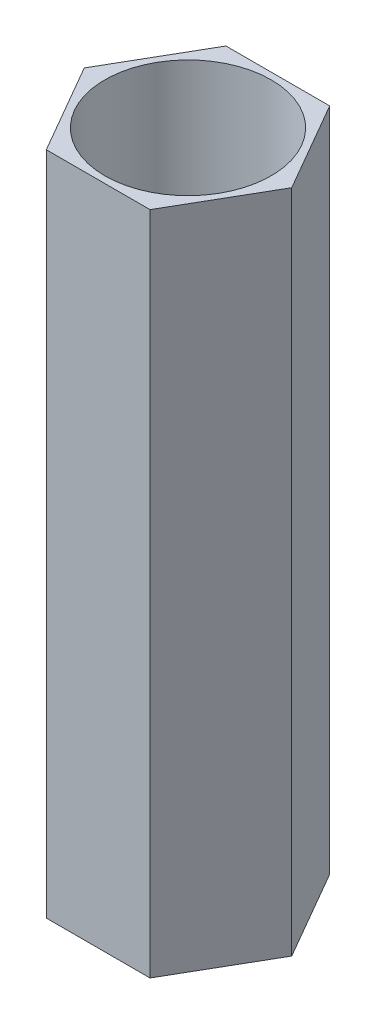
ISO-10303-21;
HEADER;
FILE_DESCRIPTION(('STEP AP214'),'2;1');
FILE_NAME('part.step','',(''),(''),'','','');
FILE_SCHEMA(('AUTOMOTIVE_DESIGN { 1 0 10303 214 1 1 1 1 }'));
ENDSEC;
DATA;
#1=APPLICATION_CONTEXT('core data for automotive mechanical design processes');
#2=APPLICATION_PROTOCOL_DEFINITION('international standard','automotive_design',2000,#1);
#3=PRODUCT_CONTEXT('',#1,'mechanical');
#4=PRODUCT('Part','Part','',(#3));
#5=PRODUCT_RELATED_PRODUCT_CATEGORY('part','',(#4));
#6=PRODUCT_DEFINITION_FORMATION('','',#4);
#7=PRODUCT_DEFINITION_CONTEXT('part definition',#1,'design');
#8=PRODUCT_DEFINITION('design','',#6,#7);
#9=PRODUCT_DEFINITION_SHAPE('','',#8);
#10=(LENGTH_UNIT() NAMED_UNIT(*) SI_UNIT(.MILLI.,.METRE.));
#11=(NAMED_UNIT(*) PLANE_ANGLE_UNIT() SI_UNIT($,.RADIAN.));
#12=(NAMED_UNIT(*) SI_UNIT($,.STERADIAN.) SOLID_ANGLE_UNIT());
#13=UNCERTAINTY_MEASURE_WITH_UNIT(LENGTH_MEASURE(1.E-05),#10,'distance_accuracy_value','');
#14=(GEOMETRIC_REPRESENTATION_CONTEXT(3) GLOBAL_UNCERTAINTY_ASSIGNED_CONTEXT((#13)) GLOBAL_UNIT_ASSIGNED_CONTEXT((#10,
#11,#12)) REPRESENTATION_CONTEXT('',''));
#15=CARTESIAN_POINT('',(0.,0.,0.));
#16=DIRECTION('',(0.,0.,1.));
#17=DIRECTION('',(1.,0.,0.));
#18=AXIS2_PLACEMENT_3D('',#15,#16,#17);
#19=CARTESIAN_POINT('',(0.,10.,0.));
#20=DIRECTION('',(0.,1.,0.));
#21=DIRECTION('',(0.,0.,1.));
#22=AXIS2_PLACEMENT_3D('',#19,#20,#21);
#23=PLANE('',#22);
#24=DIRECTION('',(1.,0.,0.));
#25=VECTOR('',#24,1.);
#26=CARTESIAN_POINT('',(-0.779422863405994,10.,1.35));
#27=LINE('',#26,#25);
#28=CARTESIAN_POINT('',(-0.779422863405994,10.,1.35));
#29=VERTEX_POINT('',#28);
#30=CARTESIAN_POINT('',(0.779422863405995,10.,1.35));
#31=VERTEX_POINT('',#30);
#32=EDGE_CURVE('E129',#29,#31,#27,.T.);
#33=ORIENTED_EDGE('',*,*,#32,.T.);
#34=DIRECTION('',(0.5,0.,-0.866025403784439));
#35=VECTOR('',#34,1.);
#36=CARTESIAN_POINT('',(0.779422863405995,10.,1.35));
#37=LINE('',#36,#35);
#38=CARTESIAN_POINT('',(1.55884572681199,10.,0.));
#39=VERTEX_POINT('',#38);
#40=EDGE_CURVE('E87',#31,#39,#37,.T.);
#41=ORIENTED_EDGE('',*,*,#40,.T.);
#42=DIRECTION('',(-0.5,0.,-0.866025403784438));
#43=VECTOR('',#42,1.);
#44=CARTESIAN_POINT('',(1.55884572681199,10.,0.));
#45=LINE('',#44,#43);
#46=CARTESIAN_POINT('',(0.779422863405994,10.,-1.35));
#47=VERTEX_POINT('',#46);
#48=EDGE_CURVE('E100',#39,#47,#45,.T.);
#49=ORIENTED_EDGE('',*,*,#48,.T.);
#50=DIRECTION('',(-1.,0.,0.));
#51=VECTOR('',#50,1.);
#52=CARTESIAN_POINT('',(0.779422863405994,10.,-1.35));
#53=LINE('',#52,#51);
#54=CARTESIAN_POINT('',(-0.779422863405995,10.,-1.35));
#55=VERTEX_POINT('',#54);
#56=EDGE_CURVE('E94',#47,#55,#53,.T.);
#57=ORIENTED_EDGE('',*,*,#56,.T.);
#58=DIRECTION('',(-0.5,0.,0.866025403784439));
#59=VECTOR('',#58,1.);
#60=CARTESIAN_POINT('',(-0.779422863405995,10.,-1.35));
#61=LINE('',#60,#59);
#62=CARTESIAN_POINT('',(-1.55884572681199,10.,0.));
#63=VERTEX_POINT('',#62);
#64=EDGE_CURVE('E98',#55,#63,#61,.T.);
#65=ORIENTED_EDGE('',*,*,#64,.T.);
#66=DIRECTION('',(0.5,0.,0.866025403784439));
#67=VECTOR('',#66,1.);
#68=CARTESIAN_POINT('',(-1.55884572681199,10.,0.));
#69=LINE('',#68,#67);
#70=EDGE_CURVE('E50',#63,#29,#69,.T.);
#71=ORIENTED_EDGE('',*,*,#70,.T.);
#72=EDGE_LOOP('',(#33,#41,#49,#57,#65,#71));
#73=FACE_BOUND('',#72,.T.);
#74=CARTESIAN_POINT('',(0.,10.,0.));
#75=DIRECTION('',(0.,1.,0.));
#76=DIRECTION('',(0.,0.,1.));
#77=AXIS2_PLACEMENT_3D('',#74,#75,#76);
#78=CIRCLE('',#77,1.25);
#79=CARTESIAN_POINT('',(0.,10.,1.25));
#80=VERTEX_POINT('',#79);
#81=EDGE_CURVE('E122',#80,#80,#78,.T.);
#82=ORIENTED_EDGE('',*,*,#81,.F.);
#83=EDGE_LOOP('',(#82));
#84=FACE_BOUND('',#83,.T.);
#85=ADVANCED_FACE('F33',(#73,#84),#23,.T.);
#86=CARTESIAN_POINT('',(0.,0.,0.));
#87=DIRECTION('',(0.,1.,0.));
#88=DIRECTION('',(0.,0.,1.));
#89=AXIS2_PLACEMENT_3D('',#86,#87,#88);
#90=PLANE('',#89);
#91=DIRECTION('',(1.,0.,0.));
#92=VECTOR('',#91,1.);
#93=CARTESIAN_POINT('',(-0.779422863405994,0.,1.35));
#94=LINE('',#93,#92);
#95=CARTESIAN_POINT('',(-0.779422863405994,0.,1.35));
#96=VERTEX_POINT('',#95);
#97=CARTESIAN_POINT('',(0.779422863405995,0.,1.35));
#98=VERTEX_POINT('',#97);
#99=EDGE_CURVE('E118',#96,#98,#94,.T.);
#100=ORIENTED_EDGE('',*,*,#99,.F.);
#101=DIRECTION('',(0.5,0.,0.866025403784439));
#102=VECTOR('',#101,1.);
#103=CARTESIAN_POINT('',(-1.55884572681199,0.,0.));
#104=LINE('',#103,#102);
#105=CARTESIAN_POINT('',(-1.55884572681199,0.,0.));
#106=VERTEX_POINT('',#105);
#107=EDGE_CURVE('E79',#106,#96,#104,.T.);
#108=ORIENTED_EDGE('',*,*,#107,.F.);
#109=DIRECTION('',(-0.5,0.,0.866025403784439));
#110=VECTOR('',#109,1.);
#111=CARTESIAN_POINT('',(-0.779422863405995,0.,-1.35));
#112=LINE('',#111,#110);
#113=CARTESIAN_POINT('',(-0.779422863405995,0.,-1.35));
#114=VERTEX_POINT('',#113);
#115=EDGE_CURVE('E73',#114,#106,#112,.T.);
#116=ORIENTED_EDGE('',*,*,#115,.F.);
#117=DIRECTION('',(-1.,0.,0.));
#118=VECTOR('',#117,1.);
#119=CARTESIAN_POINT('',(0.779422863405994,0.,-1.35));
#120=LINE('',#119,#118);
#121=CARTESIAN_POINT('',(0.779422863405994,0.,-1.35));
#122=VERTEX_POINT('',#121);
#123=EDGE_CURVE('E108',#122,#114,#120,.T.);
#124=ORIENTED_EDGE('',*,*,#123,.F.);
#125=DIRECTION('',(-0.5,0.,-0.866025403784438));
#126=VECTOR('',#125,1.);
#127=CARTESIAN_POINT('',(1.55884572681199,0.,0.));
#128=LINE('',#127,#126);
#129=CARTESIAN_POINT('',(1.55884572681199,0.,0.));
#130=VERTEX_POINT('',#129);
#131=EDGE_CURVE('E124',#130,#122,#128,.T.);
#132=ORIENTED_EDGE('',*,*,#131,.F.);
#133=DIRECTION('',(0.5,0.,-0.866025403784439));
#134=VECTOR('',#133,1.);
#135=CARTESIAN_POINT('',(0.779422863405995,0.,1.35));
#136=LINE('',#135,#134);
#137=EDGE_CURVE('E121',#98,#130,#136,.T.);
#138=ORIENTED_EDGE('',*,*,#137,.F.);
#139=EDGE_LOOP('',(#100,#108,#116,#124,#132,#138));
#140=FACE_BOUND('',#139,.T.);
#141=CARTESIAN_POINT('',(0.,0.,0.));
#142=DIRECTION('',(0.,1.,0.));
#143=DIRECTION('',(0.,0.,1.));
#144=AXIS2_PLACEMENT_3D('',#141,#142,#143);
#145=CIRCLE('',#144,1.25);
#146=CARTESIAN_POINT('',(0.,0.,1.25));
#147=VERTEX_POINT('',#146);
#148=EDGE_CURVE('E222',#147,#147,#145,.T.);
#149=ORIENTED_EDGE('',*,*,#148,.T.);
#150=EDGE_LOOP('',(#149));
#151=FACE_BOUND('',#150,.T.);
#152=ADVANCED_FACE('F138',(#140,#151),#90,.F.);
#153=CARTESIAN_POINT('',(-0.779422863405994,10.,1.35));
#154=DIRECTION('',(0.,0.,-1.));
#155=DIRECTION('',(-1.,0.,0.));
#156=AXIS2_PLACEMENT_3D('',#153,#154,#155);
#157=PLANE('',#156);
#158=ORIENTED_EDGE('',*,*,#99,.T.);
#159=DIRECTION('',(0.,-1.,0.));
#160=VECTOR('',#159,1.);
#161=CARTESIAN_POINT('',(0.779422863405995,10.,1.35));
#162=LINE('',#161,#160);
#163=EDGE_CURVE('E11',#31,#98,#162,.T.);
#164=ORIENTED_EDGE('',*,*,#163,.F.);
#165=ORIENTED_EDGE('',*,*,#32,.F.);
#166=DIRECTION('',(0.,-1.,0.));
#167=VECTOR('',#166,1.);
#168=CARTESIAN_POINT('',(-0.779422863405994,10.,1.35));
#169=LINE('',#168,#167);
#170=EDGE_CURVE('E114',#29,#96,#169,.T.);
#171=ORIENTED_EDGE('',*,*,#170,.T.);
#172=EDGE_LOOP('',(#158,#164,#165,#171));
#173=FACE_BOUND('',#172,.T.);
#174=ADVANCED_FACE('F35',(#173),#157,.F.);
#175=CARTESIAN_POINT('',(0.779422863405995,10.,1.35));
#176=DIRECTION('',(-0.866025403784438,0.,-0.5));
#177=DIRECTION('',(-0.5,0.,0.866025403784439));
#178=AXIS2_PLACEMENT_3D('',#175,#176,#177);
#179=PLANE('',#178);
#180=ORIENTED_EDGE('',*,*,#137,.T.);
#181=DIRECTION('',(0.,-1.,0.));
#182=VECTOR('',#181,1.);
#183=CARTESIAN_POINT('',(1.55884572681199,10.,0.));
#184=LINE('',#183,#182);
#185=EDGE_CURVE('E42',#39,#130,#184,.T.);
#186=ORIENTED_EDGE('',*,*,#185,.F.);
#187=ORIENTED_EDGE('',*,*,#40,.F.);
#188=ORIENTED_EDGE('',*,*,#163,.T.);
#189=EDGE_LOOP('',(#180,#186,#187,#188));
#190=FACE_BOUND('',#189,.T.);
#191=ADVANCED_FACE('F163',(#190),#179,.F.);
#192=CARTESIAN_POINT('',(1.55884572681199,10.,0.));
#193=DIRECTION('',(-0.866025403784438,0.,0.5));
#194=DIRECTION('',(0.5,0.,0.866025403784439));
#195=AXIS2_PLACEMENT_3D('',#192,#193,#194);
#196=PLANE('',#195);
#197=ORIENTED_EDGE('',*,*,#131,.T.);
#198=DIRECTION('',(0.,-1.,0.));
#199=VECTOR('',#198,1.);
#200=CARTESIAN_POINT('',(0.779422863405994,10.,-1.35));
#201=LINE('',#200,#199);
#202=EDGE_CURVE('E109',#47,#122,#201,.T.);
#203=ORIENTED_EDGE('',*,*,#202,.F.);
#204=ORIENTED_EDGE('',*,*,#48,.F.);
#205=ORIENTED_EDGE('',*,*,#185,.T.);
#206=EDGE_LOOP('',(#197,#203,#204,#205));
#207=FACE_BOUND('',#206,.T.);
#208=ADVANCED_FACE('F135',(#207),#196,.F.);
#209=CARTESIAN_POINT('',(0.779422863405994,10.,-1.35));
#210=DIRECTION('',(0.,0.,1.));
#211=DIRECTION('',(1.,0.,0.));
#212=AXIS2_PLACEMENT_3D('',#209,#210,#211);
#213=PLANE('',#212);
#214=ORIENTED_EDGE('',*,*,#123,.T.);
#215=DIRECTION('',(0.,-1.,0.));
#216=VECTOR('',#215,1.);
#217=CARTESIAN_POINT('',(-0.779422863405995,10.,-1.35));
#218=LINE('',#217,#216);
#219=EDGE_CURVE('E105',#55,#114,#218,.T.);
#220=ORIENTED_EDGE('',*,*,#219,.F.);
#221=ORIENTED_EDGE('',*,*,#56,.F.);
#222=ORIENTED_EDGE('',*,*,#202,.T.);
#223=EDGE_LOOP('',(#214,#220,#221,#222));
#224=FACE_BOUND('',#223,.T.);
#225=ADVANCED_FACE('F106',(#224),#213,.F.);
#226=CARTESIAN_POINT('',(-0.779422863405995,10.,-1.35));
#227=DIRECTION('',(0.866025403784439,0.,0.5));
#228=DIRECTION('',(0.5,0.,-0.866025403784439));
#229=AXIS2_PLACEMENT_3D('',#226,#227,#228);
#230=PLANE('',#229);
#231=ORIENTED_EDGE('',*,*,#115,.T.);
#232=DIRECTION('',(0.,-1.,0.));
#233=VECTOR('',#232,1.);
#234=CARTESIAN_POINT('',(-1.55884572681199,10.,0.));
#235=LINE('',#234,#233);
#236=EDGE_CURVE('E110',#63,#106,#235,.T.);
#237=ORIENTED_EDGE('',*,*,#236,.F.);
#238=ORIENTED_EDGE('',*,*,#64,.F.);
#239=ORIENTED_EDGE('',*,*,#219,.T.);
#240=EDGE_LOOP('',(#231,#237,#238,#239));
#241=FACE_BOUND('',#240,.T.);
#242=ADVANCED_FACE('F112',(#241),#230,.F.);
#243=CARTESIAN_POINT('',(-1.55884572681199,10.,0.));
#244=DIRECTION('',(0.866025403784439,0.,-0.5));
#245=DIRECTION('',(-0.5,0.,-0.866025403784439));
#246=AXIS2_PLACEMENT_3D('',#243,#244,#245);
#247=PLANE('',#246);
#248=ORIENTED_EDGE('',*,*,#107,.T.);
#249=ORIENTED_EDGE('',*,*,#170,.F.);
#250=ORIENTED_EDGE('',*,*,#70,.F.);
#251=ORIENTED_EDGE('',*,*,#236,.T.);
#252=EDGE_LOOP('',(#248,#249,#250,#251));
#253=FACE_BOUND('',#252,.T.);
#254=ADVANCED_FACE('F143',(#253),#247,.F.);
#255=CARTESIAN_POINT('',(0.,10.,0.));
#256=DIRECTION('',(0.,-1.,0.));
#257=DIRECTION('',(0.,0.,-1.));
#258=AXIS2_PLACEMENT_3D('',#255,#256,#257);
#259=CYLINDRICAL_SURFACE('',#258,1.25);
#260=ORIENTED_EDGE('',*,*,#81,.T.);
#261=EDGE_LOOP('',(#260));
#262=FACE_BOUND('',#261,.T.);
#263=ORIENTED_EDGE('',*,*,#148,.F.);
#264=EDGE_LOOP('',(#263));
#265=FACE_BOUND('',#264,.T.);
#266=ADVANCED_FACE('F145',(#262,#265),#259,.F.);
#267=CLOSED_SHELL('',(#85,#152,#174,#191,#208,#225,#242,#254,#266));
#268=MANIFOLD_SOLID_BREP('B2',#267);
#269=ADVANCED_BREP_SHAPE_REPRESENTATION('',(#18,#268),#14);
#270=SHAPE_DEFINITION_REPRESENTATION(#9,#269);
ENDSEC;
END-ISO-10303-21;
